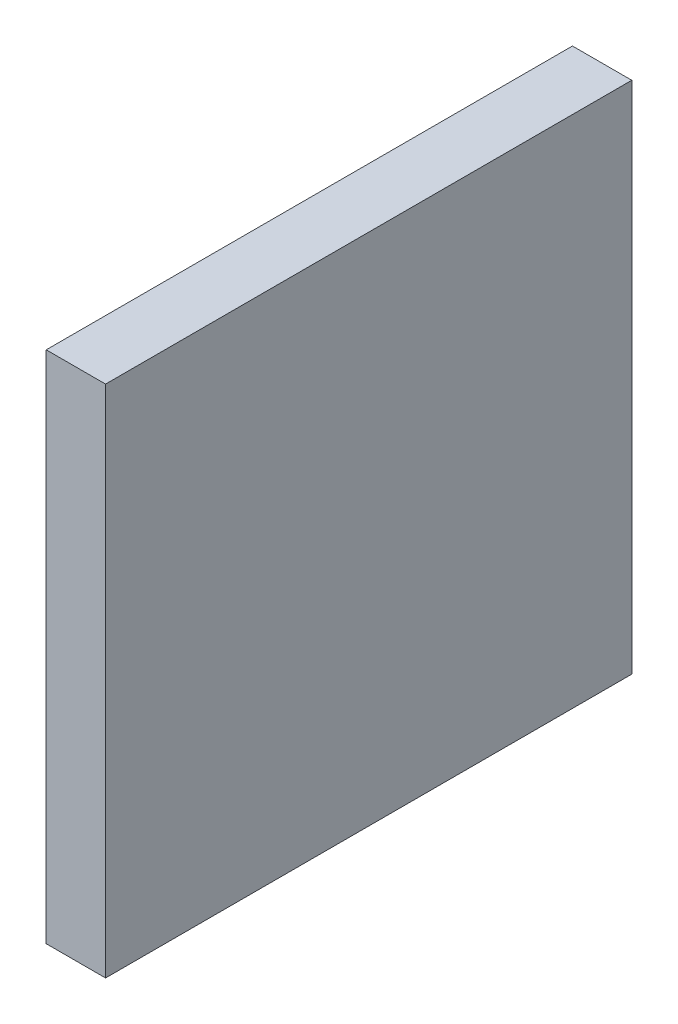
ISO-10303-21;
HEADER;
FILE_DESCRIPTION(('STEP AP214'),'2;1');
FILE_NAME('part.step','',(''),(''),'','','');
FILE_SCHEMA(('AUTOMOTIVE_DESIGN { 1 0 10303 214 1 1 1 1 }'));
ENDSEC;
DATA;
#1=APPLICATION_CONTEXT('core data for automotive mechanical design processes');
#2=APPLICATION_PROTOCOL_DEFINITION('international standard','automotive_design',2000,#1);
#3=PRODUCT_CONTEXT('',#1,'mechanical');
#4=PRODUCT('Part','Part','',(#3));
#5=PRODUCT_RELATED_PRODUCT_CATEGORY('part','',(#4));
#6=PRODUCT_DEFINITION_FORMATION('','',#4);
#7=PRODUCT_DEFINITION_CONTEXT('part definition',#1,'design');
#8=PRODUCT_DEFINITION('design','',#6,#7);
#9=PRODUCT_DEFINITION_SHAPE('','',#8);
#10=(LENGTH_UNIT() NAMED_UNIT(*) SI_UNIT(.MILLI.,.METRE.));
#11=(NAMED_UNIT(*) PLANE_ANGLE_UNIT() SI_UNIT($,.RADIAN.));
#12=(NAMED_UNIT(*) SI_UNIT($,.STERADIAN.) SOLID_ANGLE_UNIT());
#13=UNCERTAINTY_MEASURE_WITH_UNIT(LENGTH_MEASURE(1.E-05),#10,'distance_accuracy_value','');
#14=(GEOMETRIC_REPRESENTATION_CONTEXT(3) GLOBAL_UNCERTAINTY_ASSIGNED_CONTEXT((#13)) GLOBAL_UNIT_ASSIGNED_CONTEXT((#10,
#11,#12)) REPRESENTATION_CONTEXT('',''));
#15=CARTESIAN_POINT('',(0.,0.,0.));
#16=DIRECTION('',(0.,0.,1.));
#17=DIRECTION('',(1.,0.,0.));
#18=AXIS2_PLACEMENT_3D('',#15,#16,#17);
#19=CARTESIAN_POINT('',(19.05,-117.4548913678,36.9016037445471));
#20=DIRECTION('',(0.,1.,0.));
#21=DIRECTION('',(0.,0.,1.));
#22=AXIS2_PLACEMENT_3D('',#19,#20,#21);
#23=PLANE('',#22);
#24=DIRECTION('',(0.,0.,-1.));
#25=VECTOR('',#24,1.);
#26=CARTESIAN_POINT('',(0.,-117.4548913678,36.9016037445471));
#27=LINE('',#26,#25);
#28=CARTESIAN_POINT('',(0.,-117.4548913678,36.9016037445471));
#29=VERTEX_POINT('',#28);
#30=CARTESIAN_POINT('',(0.,-117.4548913678,-132.008396255453));
#31=VERTEX_POINT('',#30);
#32=EDGE_CURVE('E106',#29,#31,#27,.T.);
#33=ORIENTED_EDGE('',*,*,#32,.T.);
#34=DIRECTION('',(-1.,0.,0.));
#35=VECTOR('',#34,1.);
#36=CARTESIAN_POINT('',(19.05,-117.4548913678,-132.008396255453));
#37=LINE('',#36,#35);
#38=CARTESIAN_POINT('',(19.05,-117.4548913678,-132.008396255453));
#39=VERTEX_POINT('',#38);
#40=EDGE_CURVE('E11',#39,#31,#37,.T.);
#41=ORIENTED_EDGE('',*,*,#40,.F.);
#42=DIRECTION('',(0.,0.,-1.));
#43=VECTOR('',#42,1.);
#44=CARTESIAN_POINT('',(19.05,-117.4548913678,36.9016037445471));
#45=LINE('',#44,#43);
#46=CARTESIAN_POINT('',(19.05,-117.4548913678,36.9016037445471));
#47=VERTEX_POINT('',#46);
#48=EDGE_CURVE('E79',#47,#39,#45,.T.);
#49=ORIENTED_EDGE('',*,*,#48,.F.);
#50=DIRECTION('',(-1.,0.,0.));
#51=VECTOR('',#50,1.);
#52=CARTESIAN_POINT('',(19.05,-117.4548913678,36.9016037445471));
#53=LINE('',#52,#51);
#54=EDGE_CURVE('E102',#47,#29,#53,.T.);
#55=ORIENTED_EDGE('',*,*,#54,.T.);
#56=EDGE_LOOP('',(#33,#41,#49,#55));
#57=FACE_BOUND('',#56,.T.);
#58=ADVANCED_FACE('F39',(#57),#23,.F.);
#59=CARTESIAN_POINT('',(19.05,47.6451086322001,-132.008396255453));
#60=DIRECTION('',(0.,0.,-1.));
#61=DIRECTION('',(0.,1.,0.));
#62=AXIS2_PLACEMENT_3D('',#59,#60,#61);
#63=PLANE('',#62);
#64=DIRECTION('',(0.,-1.,0.));
#65=VECTOR('',#64,1.);
#66=CARTESIAN_POINT('',(0.,47.6451086322001,-132.008396255453));
#67=LINE('',#66,#65);
#68=CARTESIAN_POINT('',(0.,47.6451086322001,-132.008396255453));
#69=VERTEX_POINT('',#68);
#70=EDGE_CURVE('E88',#69,#31,#67,.T.);
#71=ORIENTED_EDGE('',*,*,#70,.F.);
#72=DIRECTION('',(-1.,0.,0.));
#73=VECTOR('',#72,1.);
#74=CARTESIAN_POINT('',(19.05,47.6451086322001,-132.008396255453));
#75=LINE('',#74,#73);
#76=CARTESIAN_POINT('',(19.05,47.6451086322001,-132.008396255453));
#77=VERTEX_POINT('',#76);
#78=EDGE_CURVE('E48',#77,#69,#75,.T.);
#79=ORIENTED_EDGE('',*,*,#78,.F.);
#80=DIRECTION('',(0.,-1.,0.));
#81=VECTOR('',#80,1.);
#82=CARTESIAN_POINT('',(19.05,47.6451086322001,-132.008396255453));
#83=LINE('',#82,#81);
#84=EDGE_CURVE('E86',#77,#39,#83,.T.);
#85=ORIENTED_EDGE('',*,*,#84,.T.);
#86=ORIENTED_EDGE('',*,*,#40,.T.);
#87=EDGE_LOOP('',(#71,#79,#85,#86));
#88=FACE_BOUND('',#87,.T.);
#89=ADVANCED_FACE('F85',(#88),#63,.T.);
#90=CARTESIAN_POINT('',(19.05,47.6451086322001,36.9016037445472));
#91=DIRECTION('',(0.,1.,0.));
#92=DIRECTION('',(0.,0.,1.));
#93=AXIS2_PLACEMENT_3D('',#90,#91,#92);
#94=PLANE('',#93);
#95=DIRECTION('',(0.,0.,-1.));
#96=VECTOR('',#95,1.);
#97=CARTESIAN_POINT('',(0.,47.6451086322001,36.9016037445472));
#98=LINE('',#97,#96);
#99=CARTESIAN_POINT('',(0.,47.6451086322001,36.9016037445472));
#100=VERTEX_POINT('',#99);
#101=EDGE_CURVE('E112',#100,#69,#98,.T.);
#102=ORIENTED_EDGE('',*,*,#101,.F.);
#103=DIRECTION('',(-1.,0.,0.));
#104=VECTOR('',#103,1.);
#105=CARTESIAN_POINT('',(19.05,47.6451086322001,36.9016037445472));
#106=LINE('',#105,#104);
#107=CARTESIAN_POINT('',(19.05,47.6451086322001,36.9016037445472));
#108=VERTEX_POINT('',#107);
#109=EDGE_CURVE('E71',#108,#100,#106,.T.);
#110=ORIENTED_EDGE('',*,*,#109,.F.);
#111=DIRECTION('',(0.,0.,-1.));
#112=VECTOR('',#111,1.);
#113=CARTESIAN_POINT('',(19.05,47.6451086322001,36.9016037445472));
#114=LINE('',#113,#112);
#115=EDGE_CURVE('E95',#108,#77,#114,.T.);
#116=ORIENTED_EDGE('',*,*,#115,.T.);
#117=ORIENTED_EDGE('',*,*,#78,.T.);
#118=EDGE_LOOP('',(#102,#110,#116,#117));
#119=FACE_BOUND('',#118,.T.);
#120=ADVANCED_FACE('F98',(#119),#94,.T.);
#121=CARTESIAN_POINT('',(19.05,47.6451086322001,36.9016037445472));
#122=DIRECTION('',(0.,0.,-1.));
#123=DIRECTION('',(0.,1.,0.));
#124=AXIS2_PLACEMENT_3D('',#121,#122,#123);
#125=PLANE('',#124);
#126=DIRECTION('',(0.,-1.,0.));
#127=VECTOR('',#126,1.);
#128=CARTESIAN_POINT('',(0.,47.6451086322001,36.9016037445472));
#129=LINE('',#128,#127);
#130=EDGE_CURVE('E74',#100,#29,#129,.T.);
#131=ORIENTED_EDGE('',*,*,#130,.T.);
#132=ORIENTED_EDGE('',*,*,#54,.F.);
#133=DIRECTION('',(0.,-1.,0.));
#134=VECTOR('',#133,1.);
#135=CARTESIAN_POINT('',(19.05,47.6451086322001,36.9016037445472));
#136=LINE('',#135,#134);
#137=EDGE_CURVE('E56',#108,#47,#136,.T.);
#138=ORIENTED_EDGE('',*,*,#137,.F.);
#139=ORIENTED_EDGE('',*,*,#109,.T.);
#140=EDGE_LOOP('',(#131,#132,#138,#139));
#141=FACE_BOUND('',#140,.T.);
#142=ADVANCED_FACE('F129',(#141),#125,.F.);
#143=CARTESIAN_POINT('',(19.05,0.,0.));
#144=DIRECTION('',(-1.,0.,0.));
#145=DIRECTION('',(0.,0.,1.));
#146=AXIS2_PLACEMENT_3D('',#143,#144,#145);
#147=PLANE('',#146);
#148=ORIENTED_EDGE('',*,*,#48,.T.);
#149=ORIENTED_EDGE('',*,*,#84,.F.);
#150=ORIENTED_EDGE('',*,*,#115,.F.);
#151=ORIENTED_EDGE('',*,*,#137,.T.);
#152=EDGE_LOOP('',(#148,#149,#150,#151));
#153=FACE_BOUND('',#152,.T.);
#154=ADVANCED_FACE('F94',(#153),#147,.F.);
#155=CARTESIAN_POINT('',(0.,0.,0.));
#156=DIRECTION('',(-1.,0.,0.));
#157=DIRECTION('',(0.,0.,1.));
#158=AXIS2_PLACEMENT_3D('',#155,#156,#157);
#159=PLANE('',#158);
#160=ORIENTED_EDGE('',*,*,#32,.F.);
#161=ORIENTED_EDGE('',*,*,#130,.F.);
#162=ORIENTED_EDGE('',*,*,#101,.T.);
#163=ORIENTED_EDGE('',*,*,#70,.T.);
#164=EDGE_LOOP('',(#160,#161,#162,#163));
#165=FACE_BOUND('',#164,.T.);
#166=ADVANCED_FACE('F123',(#165),#159,.T.);
#167=CLOSED_SHELL('',(#58,#89,#120,#142,#154,#166));
#168=MANIFOLD_SOLID_BREP('B2',#167);
#169=ADVANCED_BREP_SHAPE_REPRESENTATION('',(#18,#168),#14);
#170=SHAPE_DEFINITION_REPRESENTATION(#9,#169);
ENDSEC;
END-ISO-10303-21;
